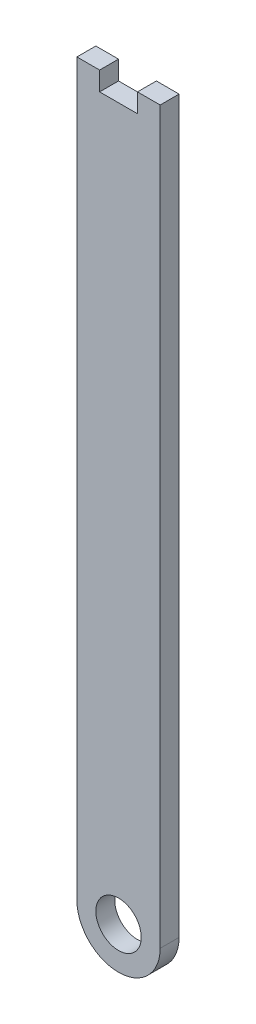
ISO-10303-21;
HEADER;
FILE_DESCRIPTION(('STEP AP214'),'2;1');
FILE_NAME('part.step','',(''),(''),'','','');
FILE_SCHEMA(('AUTOMOTIVE_DESIGN { 1 0 10303 214 1 1 1 1 }'));
ENDSEC;
DATA;
#1=APPLICATION_CONTEXT('core data for automotive mechanical design processes');
#2=APPLICATION_PROTOCOL_DEFINITION('international standard','automotive_design',2000,#1);
#3=PRODUCT_CONTEXT('',#1,'mechanical');
#4=PRODUCT('Part','Part','',(#3));
#5=PRODUCT_RELATED_PRODUCT_CATEGORY('part','',(#4));
#6=PRODUCT_DEFINITION_FORMATION('','',#4);
#7=PRODUCT_DEFINITION_CONTEXT('part definition',#1,'design');
#8=PRODUCT_DEFINITION('design','',#6,#7);
#9=PRODUCT_DEFINITION_SHAPE('','',#8);
#10=(LENGTH_UNIT() NAMED_UNIT(*) SI_UNIT(.MILLI.,.METRE.));
#11=(NAMED_UNIT(*) PLANE_ANGLE_UNIT() SI_UNIT($,.RADIAN.));
#12=(NAMED_UNIT(*) SI_UNIT($,.STERADIAN.) SOLID_ANGLE_UNIT());
#13=UNCERTAINTY_MEASURE_WITH_UNIT(LENGTH_MEASURE(1.E-05),#10,'distance_accuracy_value','');
#14=(GEOMETRIC_REPRESENTATION_CONTEXT(3) GLOBAL_UNCERTAINTY_ASSIGNED_CONTEXT((#13)) GLOBAL_UNIT_ASSIGNED_CONTEXT((#10,
#11,#12)) REPRESENTATION_CONTEXT('',''));
#15=CARTESIAN_POINT('',(0.,0.,0.));
#16=DIRECTION('',(0.,0.,1.));
#17=DIRECTION('',(1.,0.,0.));
#18=AXIS2_PLACEMENT_3D('',#15,#16,#17);
#19=CARTESIAN_POINT('',(0.,0.,2.5));
#20=DIRECTION('',(0.,0.,1.));
#21=DIRECTION('',(1.,0.,0.));
#22=AXIS2_PLACEMENT_3D('',#19,#20,#21);
#23=PLANE('',#22);
#24=CARTESIAN_POINT('',(0.,0.,2.5));
#25=DIRECTION('',(0.,0.,1.));
#26=DIRECTION('',(1.,0.,0.));
#27=AXIS2_PLACEMENT_3D('',#24,#25,#26);
#28=CIRCLE('',#27,11.);
#29=CARTESIAN_POINT('',(-11.,0.,2.5));
#30=VERTEX_POINT('',#29);
#31=CARTESIAN_POINT('',(11.,0.,2.5));
#32=VERTEX_POINT('',#31);
#33=EDGE_CURVE('E151',#30,#32,#28,.T.);
#34=ORIENTED_EDGE('',*,*,#33,.T.);
#35=DIRECTION('',(0.,1.,0.));
#36=VECTOR('',#35,1.);
#37=CARTESIAN_POINT('',(11.,0.,2.5));
#38=LINE('',#37,#36);
#39=CARTESIAN_POINT('',(11.,193.,2.5));
#40=VERTEX_POINT('',#39);
#41=EDGE_CURVE('E99',#32,#40,#38,.T.);
#42=ORIENTED_EDGE('',*,*,#41,.T.);
#43=DIRECTION('',(-1.,0.,0.));
#44=VECTOR('',#43,1.);
#45=CARTESIAN_POINT('',(4.99999999999998,193.,2.5));
#46=LINE('',#45,#44);
#47=CARTESIAN_POINT('',(4.99999999999998,193.,2.5));
#48=VERTEX_POINT('',#47);
#49=EDGE_CURVE('E166',#40,#48,#46,.T.);
#50=ORIENTED_EDGE('',*,*,#49,.T.);
#51=DIRECTION('',(0.,-1.,0.));
#52=VECTOR('',#51,1.);
#53=CARTESIAN_POINT('',(5.00000000000002,188.,2.5));
#54=LINE('',#53,#52);
#55=CARTESIAN_POINT('',(5.00000000000002,188.,2.5));
#56=VERTEX_POINT('',#55);
#57=EDGE_CURVE('E179',#48,#56,#54,.T.);
#58=ORIENTED_EDGE('',*,*,#57,.T.);
#59=DIRECTION('',(-1.,0.,0.));
#60=VECTOR('',#59,1.);
#61=CARTESIAN_POINT('',(5.00000000000002,188.,2.5));
#62=LINE('',#61,#60);
#63=CARTESIAN_POINT('',(-4.99999999999998,188.,2.5));
#64=VERTEX_POINT('',#63);
#65=EDGE_CURVE('E118',#56,#64,#62,.T.);
#66=ORIENTED_EDGE('',*,*,#65,.T.);
#67=DIRECTION('',(0.,1.,0.));
#68=VECTOR('',#67,1.);
#69=CARTESIAN_POINT('',(-4.99999999999998,188.,2.5));
#70=LINE('',#69,#68);
#71=CARTESIAN_POINT('',(-4.99999999999998,193.,2.5));
#72=VERTEX_POINT('',#71);
#73=EDGE_CURVE('E112',#64,#72,#70,.T.);
#74=ORIENTED_EDGE('',*,*,#73,.T.);
#75=DIRECTION('',(-1.,0.,0.));
#76=VECTOR('',#75,1.);
#77=CARTESIAN_POINT('',(-4.99999999999998,193.,2.5));
#78=LINE('',#77,#76);
#79=CARTESIAN_POINT('',(-11.,193.,2.5));
#80=VERTEX_POINT('',#79);
#81=EDGE_CURVE('E116',#72,#80,#78,.T.);
#82=ORIENTED_EDGE('',*,*,#81,.T.);
#83=DIRECTION('',(0.,-1.,0.));
#84=VECTOR('',#83,1.);
#85=CARTESIAN_POINT('',(-11.,0.,2.5));
#86=LINE('',#85,#84);
#87=EDGE_CURVE('E56',#80,#30,#86,.T.);
#88=ORIENTED_EDGE('',*,*,#87,.T.);
#89=EDGE_LOOP('',(#34,#42,#50,#58,#66,#74,#82,#88));
#90=FACE_BOUND('',#89,.T.);
#91=CARTESIAN_POINT('',(0.,0.,2.5));
#92=DIRECTION('',(0.,0.,1.));
#93=DIRECTION('',(1.,0.,0.));
#94=AXIS2_PLACEMENT_3D('',#91,#92,#93);
#95=CIRCLE('',#94,6.);
#96=CARTESIAN_POINT('',(6.,0.,2.5));
#97=VERTEX_POINT('',#96);
#98=EDGE_CURVE('E140',#97,#97,#95,.T.);
#99=ORIENTED_EDGE('',*,*,#98,.F.);
#100=EDGE_LOOP('',(#99));
#101=FACE_BOUND('',#100,.T.);
#102=ADVANCED_FACE('F39',(#90,#101),#23,.T.);
#103=CARTESIAN_POINT('',(0.,0.,-2.5));
#104=DIRECTION('',(0.,0.,1.));
#105=DIRECTION('',(1.,0.,0.));
#106=AXIS2_PLACEMENT_3D('',#103,#104,#105);
#107=PLANE('',#106);
#108=CARTESIAN_POINT('',(0.,0.,-2.5));
#109=DIRECTION('',(0.,0.,1.));
#110=DIRECTION('',(1.,0.,0.));
#111=AXIS2_PLACEMENT_3D('',#108,#109,#110);
#112=CIRCLE('',#111,11.);
#113=CARTESIAN_POINT('',(-11.,0.,-2.5));
#114=VERTEX_POINT('',#113);
#115=CARTESIAN_POINT('',(11.,0.,-2.5));
#116=VERTEX_POINT('',#115);
#117=EDGE_CURVE('E136',#114,#116,#112,.T.);
#118=ORIENTED_EDGE('',*,*,#117,.F.);
#119=DIRECTION('',(0.,-1.,0.));
#120=VECTOR('',#119,1.);
#121=CARTESIAN_POINT('',(-11.,0.,-2.5));
#122=LINE('',#121,#120);
#123=CARTESIAN_POINT('',(-11.,193.,-2.5));
#124=VERTEX_POINT('',#123);
#125=EDGE_CURVE('E91',#124,#114,#122,.T.);
#126=ORIENTED_EDGE('',*,*,#125,.F.);
#127=DIRECTION('',(-1.,0.,0.));
#128=VECTOR('',#127,1.);
#129=CARTESIAN_POINT('',(-4.99999999999998,193.,-2.5));
#130=LINE('',#129,#128);
#131=CARTESIAN_POINT('',(-4.99999999999998,193.,-2.5));
#132=VERTEX_POINT('',#131);
#133=EDGE_CURVE('E85',#132,#124,#130,.T.);
#134=ORIENTED_EDGE('',*,*,#133,.F.);
#135=DIRECTION('',(0.,1.,0.));
#136=VECTOR('',#135,1.);
#137=CARTESIAN_POINT('',(-4.99999999999998,188.,-2.5));
#138=LINE('',#137,#136);
#139=CARTESIAN_POINT('',(-4.99999999999998,188.,-2.5));
#140=VERTEX_POINT('',#139);
#141=EDGE_CURVE('E126',#140,#132,#138,.T.);
#142=ORIENTED_EDGE('',*,*,#141,.F.);
#143=DIRECTION('',(-1.,0.,0.));
#144=VECTOR('',#143,1.);
#145=CARTESIAN_POINT('',(5.00000000000002,188.,-2.5));
#146=LINE('',#145,#144);
#147=CARTESIAN_POINT('',(5.00000000000002,188.,-2.5));
#148=VERTEX_POINT('',#147);
#149=EDGE_CURVE('E146',#148,#140,#146,.T.);
#150=ORIENTED_EDGE('',*,*,#149,.F.);
#151=DIRECTION('',(0.,-1.,0.));
#152=VECTOR('',#151,1.);
#153=CARTESIAN_POINT('',(5.00000000000002,188.,-2.5));
#154=LINE('',#153,#152);
#155=CARTESIAN_POINT('',(4.99999999999998,193.,-2.5));
#156=VERTEX_POINT('',#155);
#157=EDGE_CURVE('E144',#156,#148,#154,.T.);
#158=ORIENTED_EDGE('',*,*,#157,.F.);
#159=DIRECTION('',(-1.,0.,0.));
#160=VECTOR('',#159,1.);
#161=CARTESIAN_POINT('',(4.99999999999998,193.,-2.5));
#162=LINE('',#161,#160);
#163=CARTESIAN_POINT('',(11.,193.,-2.5));
#164=VERTEX_POINT('',#163);
#165=EDGE_CURVE('E142',#164,#156,#162,.T.);
#166=ORIENTED_EDGE('',*,*,#165,.F.);
#167=DIRECTION('',(0.,1.,0.));
#168=VECTOR('',#167,1.);
#169=CARTESIAN_POINT('',(11.,0.,-2.5));
#170=LINE('',#169,#168);
#171=EDGE_CURVE('E139',#116,#164,#170,.T.);
#172=ORIENTED_EDGE('',*,*,#171,.F.);
#173=EDGE_LOOP('',(#118,#126,#134,#142,#150,#158,#166,#172));
#174=FACE_BOUND('',#173,.T.);
#175=CARTESIAN_POINT('',(0.,0.,-2.5));
#176=DIRECTION('',(0.,0.,1.));
#177=DIRECTION('',(1.,0.,0.));
#178=AXIS2_PLACEMENT_3D('',#175,#176,#177);
#179=CIRCLE('',#178,6.);
#180=CARTESIAN_POINT('',(6.,0.,-2.5));
#181=VERTEX_POINT('',#180);
#182=EDGE_CURVE('E185',#181,#181,#179,.T.);
#183=ORIENTED_EDGE('',*,*,#182,.T.);
#184=EDGE_LOOP('',(#183));
#185=FACE_BOUND('',#184,.T.);
#186=ADVANCED_FACE('F170',(#174,#185),#107,.F.);
#187=CARTESIAN_POINT('',(0.,0.,2.5));
#188=DIRECTION('',(0.,0.,-1.));
#189=DIRECTION('',(-1.,0.,0.));
#190=AXIS2_PLACEMENT_3D('',#187,#188,#189);
#191=CYLINDRICAL_SURFACE('',#190,11.);
#192=ORIENTED_EDGE('',*,*,#117,.T.);
#193=DIRECTION('',(0.,0.,-1.));
#194=VECTOR('',#193,1.);
#195=CARTESIAN_POINT('',(11.,0.,2.5));
#196=LINE('',#195,#194);
#197=EDGE_CURVE('E11',#32,#116,#196,.T.);
#198=ORIENTED_EDGE('',*,*,#197,.F.);
#199=ORIENTED_EDGE('',*,*,#33,.F.);
#200=DIRECTION('',(0.,0.,-1.));
#201=VECTOR('',#200,1.);
#202=CARTESIAN_POINT('',(-11.,0.,2.5));
#203=LINE('',#202,#201);
#204=EDGE_CURVE('E132',#30,#114,#203,.T.);
#205=ORIENTED_EDGE('',*,*,#204,.T.);
#206=EDGE_LOOP('',(#192,#198,#199,#205));
#207=FACE_BOUND('',#206,.T.);
#208=ADVANCED_FACE('F41',(#207),#191,.T.);
#209=CARTESIAN_POINT('',(11.,0.,2.5));
#210=DIRECTION('',(-1.,0.,0.));
#211=DIRECTION('',(0.,-1.,0.));
#212=AXIS2_PLACEMENT_3D('',#209,#210,#211);
#213=PLANE('',#212);
#214=ORIENTED_EDGE('',*,*,#171,.T.);
#215=DIRECTION('',(0.,0.,-1.));
#216=VECTOR('',#215,1.);
#217=CARTESIAN_POINT('',(11.,193.,2.5));
#218=LINE('',#217,#216);
#219=EDGE_CURVE('E48',#40,#164,#218,.T.);
#220=ORIENTED_EDGE('',*,*,#219,.F.);
#221=ORIENTED_EDGE('',*,*,#41,.F.);
#222=ORIENTED_EDGE('',*,*,#197,.T.);
#223=EDGE_LOOP('',(#214,#220,#221,#222));
#224=FACE_BOUND('',#223,.T.);
#225=ADVANCED_FACE('F213',(#224),#213,.F.);
#226=CARTESIAN_POINT('',(4.99999999999998,193.,2.5));
#227=DIRECTION('',(0.,-1.,0.));
#228=DIRECTION('',(0.,0.,-1.));
#229=AXIS2_PLACEMENT_3D('',#226,#227,#228);
#230=PLANE('',#229);
#231=ORIENTED_EDGE('',*,*,#165,.T.);
#232=DIRECTION('',(0.,0.,-1.));
#233=VECTOR('',#232,1.);
#234=CARTESIAN_POINT('',(4.99999999999998,193.,2.5));
#235=LINE('',#234,#233);
#236=EDGE_CURVE('E158',#48,#156,#235,.T.);
#237=ORIENTED_EDGE('',*,*,#236,.F.);
#238=ORIENTED_EDGE('',*,*,#49,.F.);
#239=ORIENTED_EDGE('',*,*,#219,.T.);
#240=EDGE_LOOP('',(#231,#237,#238,#239));
#241=FACE_BOUND('',#240,.T.);
#242=ADVANCED_FACE('F164',(#241),#230,.F.);
#243=CARTESIAN_POINT('',(5.00000000000002,188.,2.5));
#244=DIRECTION('',(1.,0.,0.));
#245=DIRECTION('',(0.,1.,0.));
#246=AXIS2_PLACEMENT_3D('',#243,#244,#245);
#247=PLANE('',#246);
#248=ORIENTED_EDGE('',*,*,#157,.T.);
#249=DIRECTION('',(0.,0.,-1.));
#250=VECTOR('',#249,1.);
#251=CARTESIAN_POINT('',(5.00000000000002,188.,2.5));
#252=LINE('',#251,#250);
#253=EDGE_CURVE('E155',#56,#148,#252,.T.);
#254=ORIENTED_EDGE('',*,*,#253,.F.);
#255=ORIENTED_EDGE('',*,*,#57,.F.);
#256=ORIENTED_EDGE('',*,*,#236,.T.);
#257=EDGE_LOOP('',(#248,#254,#255,#256));
#258=FACE_BOUND('',#257,.T.);
#259=ADVANCED_FACE('F175',(#258),#247,.F.);
#260=CARTESIAN_POINT('',(5.00000000000002,188.,2.5));
#261=DIRECTION('',(0.,-1.,0.));
#262=DIRECTION('',(0.,0.,-1.));
#263=AXIS2_PLACEMENT_3D('',#260,#261,#262);
#264=PLANE('',#263);
#265=ORIENTED_EDGE('',*,*,#149,.T.);
#266=DIRECTION('',(0.,0.,-1.));
#267=VECTOR('',#266,1.);
#268=CARTESIAN_POINT('',(-4.99999999999998,188.,2.5));
#269=LINE('',#268,#267);
#270=EDGE_CURVE('E127',#64,#140,#269,.T.);
#271=ORIENTED_EDGE('',*,*,#270,.F.);
#272=ORIENTED_EDGE('',*,*,#65,.F.);
#273=ORIENTED_EDGE('',*,*,#253,.T.);
#274=EDGE_LOOP('',(#265,#271,#272,#273));
#275=FACE_BOUND('',#274,.T.);
#276=ADVANCED_FACE('F178',(#275),#264,.F.);
#277=CARTESIAN_POINT('',(-4.99999999999998,188.,2.5));
#278=DIRECTION('',(-1.,0.,0.));
#279=DIRECTION('',(0.,0.,1.));
#280=AXIS2_PLACEMENT_3D('',#277,#278,#279);
#281=PLANE('',#280);
#282=ORIENTED_EDGE('',*,*,#141,.T.);
#283=DIRECTION('',(0.,0.,-1.));
#284=VECTOR('',#283,1.);
#285=CARTESIAN_POINT('',(-4.99999999999998,193.,2.5));
#286=LINE('',#285,#284);
#287=EDGE_CURVE('E123',#72,#132,#286,.T.);
#288=ORIENTED_EDGE('',*,*,#287,.F.);
#289=ORIENTED_EDGE('',*,*,#73,.F.);
#290=ORIENTED_EDGE('',*,*,#270,.T.);
#291=EDGE_LOOP('',(#282,#288,#289,#290));
#292=FACE_BOUND('',#291,.T.);
#293=ADVANCED_FACE('F124',(#292),#281,.F.);
#294=CARTESIAN_POINT('',(-4.99999999999998,193.,2.5));
#295=DIRECTION('',(0.,-1.,0.));
#296=DIRECTION('',(0.,0.,-1.));
#297=AXIS2_PLACEMENT_3D('',#294,#295,#296);
#298=PLANE('',#297);
#299=ORIENTED_EDGE('',*,*,#133,.T.);
#300=DIRECTION('',(0.,0.,-1.));
#301=VECTOR('',#300,1.);
#302=CARTESIAN_POINT('',(-11.,193.,2.5));
#303=LINE('',#302,#301);
#304=EDGE_CURVE('E128',#80,#124,#303,.T.);
#305=ORIENTED_EDGE('',*,*,#304,.F.);
#306=ORIENTED_EDGE('',*,*,#81,.F.);
#307=ORIENTED_EDGE('',*,*,#287,.T.);
#308=EDGE_LOOP('',(#299,#305,#306,#307));
#309=FACE_BOUND('',#308,.T.);
#310=ADVANCED_FACE('F130',(#309),#298,.F.);
#311=CARTESIAN_POINT('',(-11.,0.,2.5));
#312=DIRECTION('',(1.,0.,0.));
#313=DIRECTION('',(0.,1.,0.));
#314=AXIS2_PLACEMENT_3D('',#311,#312,#313);
#315=PLANE('',#314);
#316=ORIENTED_EDGE('',*,*,#125,.T.);
#317=ORIENTED_EDGE('',*,*,#204,.F.);
#318=ORIENTED_EDGE('',*,*,#87,.F.);
#319=ORIENTED_EDGE('',*,*,#304,.T.);
#320=EDGE_LOOP('',(#316,#317,#318,#319));
#321=FACE_BOUND('',#320,.T.);
#322=ADVANCED_FACE('F201',(#321),#315,.F.);
#323=CARTESIAN_POINT('',(0.,0.,2.5));
#324=DIRECTION('',(0.,0.,-1.));
#325=DIRECTION('',(-1.,0.,0.));
#326=AXIS2_PLACEMENT_3D('',#323,#324,#325);
#327=CYLINDRICAL_SURFACE('',#326,6.);
#328=ORIENTED_EDGE('',*,*,#98,.T.);
#329=EDGE_LOOP('',(#328));
#330=FACE_BOUND('',#329,.T.);
#331=ORIENTED_EDGE('',*,*,#182,.F.);
#332=EDGE_LOOP('',(#331));
#333=FACE_BOUND('',#332,.T.);
#334=ADVANCED_FACE('F191',(#330,#333),#327,.F.);
#335=CLOSED_SHELL('',(#102,#186,#208,#225,#242,#259,#276,#293,#310,#322,#334));
#336=MANIFOLD_SOLID_BREP('B2',#335);
#337=ADVANCED_BREP_SHAPE_REPRESENTATION('',(#18,#336),#14);
#338=SHAPE_DEFINITION_REPRESENTATION(#9,#337);
ENDSEC;
END-ISO-10303-21;
